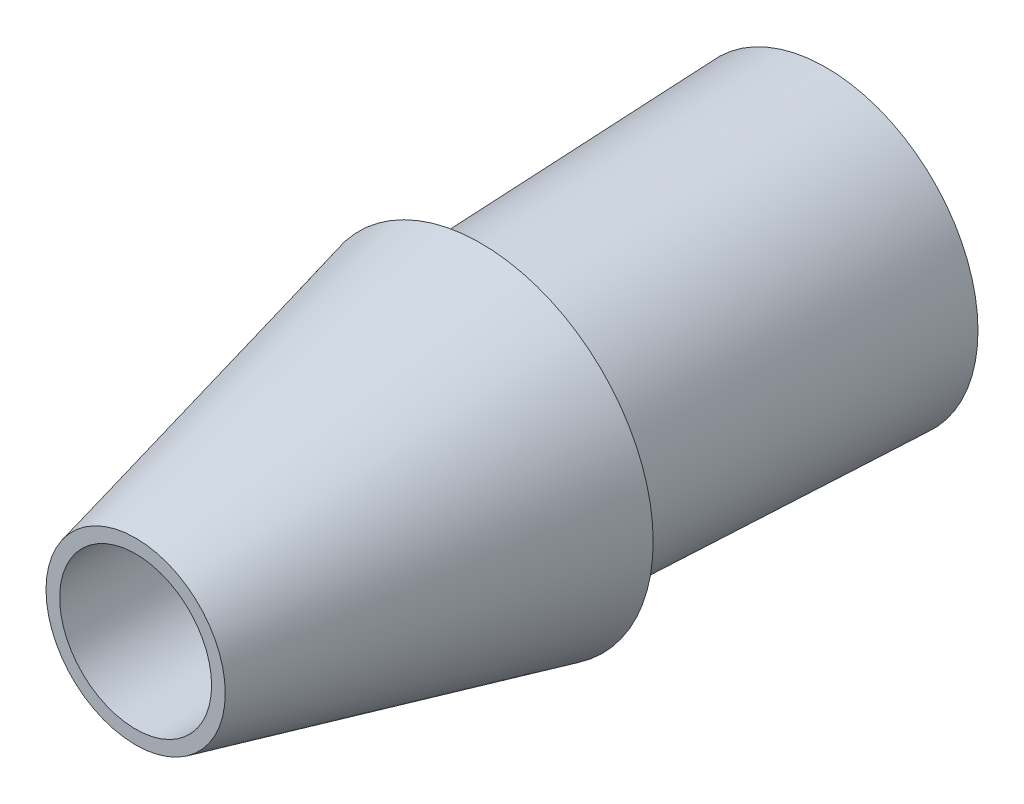
ISO-10303-21;
HEADER;
FILE_DESCRIPTION(('STEP AP214'),'2;1');
FILE_NAME('part.step','',(''),(''),'','','');
FILE_SCHEMA(('AUTOMOTIVE_DESIGN { 1 0 10303 214 1 1 1 1 }'));
ENDSEC;
DATA;
#1=APPLICATION_CONTEXT('core data for automotive mechanical design processes');
#2=APPLICATION_PROTOCOL_DEFINITION('international standard','automotive_design',2000,#1);
#3=PRODUCT_CONTEXT('',#1,'mechanical');
#4=PRODUCT('Part','Part','',(#3));
#5=PRODUCT_RELATED_PRODUCT_CATEGORY('part','',(#4));
#6=PRODUCT_DEFINITION_FORMATION('','',#4);
#7=PRODUCT_DEFINITION_CONTEXT('part definition',#1,'design');
#8=PRODUCT_DEFINITION('design','',#6,#7);
#9=PRODUCT_DEFINITION_SHAPE('','',#8);
#10=(LENGTH_UNIT() NAMED_UNIT(*) SI_UNIT(.MILLI.,.METRE.));
#11=(NAMED_UNIT(*) PLANE_ANGLE_UNIT() SI_UNIT($,.RADIAN.));
#12=(NAMED_UNIT(*) SI_UNIT($,.STERADIAN.) SOLID_ANGLE_UNIT());
#13=UNCERTAINTY_MEASURE_WITH_UNIT(LENGTH_MEASURE(1.E-05),#10,'distance_accuracy_value','');
#14=(GEOMETRIC_REPRESENTATION_CONTEXT(3) GLOBAL_UNCERTAINTY_ASSIGNED_CONTEXT((#13)) GLOBAL_UNIT_ASSIGNED_CONTEXT((#10,
#11,#12)) REPRESENTATION_CONTEXT('',''));
#15=CARTESIAN_POINT('',(0.,0.,0.));
#16=DIRECTION('',(0.,0.,1.));
#17=DIRECTION('',(1.,0.,0.));
#18=AXIS2_PLACEMENT_3D('',#15,#16,#17);
#19=CARTESIAN_POINT('',(0.,0.,0.));
#20=DIRECTION('',(0.,0.,1.));
#21=DIRECTION('',(1.,0.,0.));
#22=AXIS2_PLACEMENT_3D('',#19,#20,#21);
#23=PLANE('',#22);
#24=CARTESIAN_POINT('',(0.,0.,0.));
#25=DIRECTION('',(0.,0.,1.));
#26=DIRECTION('',(1.,0.,0.));
#27=AXIS2_PLACEMENT_3D('',#24,#25,#26);
#28=CIRCLE('',#27,0.903642252561761);
#29=CARTESIAN_POINT('',(0.903642252561761,0.,0.));
#30=VERTEX_POINT('',#29);
#31=EDGE_CURVE('E56',#30,#30,#28,.T.);
#32=ORIENTED_EDGE('',*,*,#31,.T.);
#33=EDGE_LOOP('',(#32));
#34=FACE_BOUND('',#33,.T.);
#35=CARTESIAN_POINT('',(0.,0.,0.));
#36=DIRECTION('',(0.,0.,1.));
#37=DIRECTION('',(1.,0.,0.));
#38=AXIS2_PLACEMENT_3D('',#35,#36,#37);
#39=CIRCLE('',#38,1.1);
#40=CARTESIAN_POINT('',(1.1,0.,0.));
#41=VERTEX_POINT('',#40);
#42=EDGE_CURVE('E50',#41,#41,#39,.T.);
#43=ORIENTED_EDGE('',*,*,#42,.F.);
#44=EDGE_LOOP('',(#43));
#45=FACE_BOUND('',#44,.T.);
#46=ADVANCED_FACE('F41',(#34,#45),#23,.F.);
#47=CARTESIAN_POINT('',(0.,0.,2.5));
#48=DIRECTION('',(0.,0.,-1.));
#49=DIRECTION('',(-1.,0.,0.));
#50=AXIS2_PLACEMENT_3D('',#47,#48,#49);
#51=CONICAL_SURFACE('',#50,1.00380867021687,0.0384575613173809);
#52=ORIENTED_EDGE('',*,*,#42,.T.);
#53=EDGE_LOOP('',(#52));
#54=FACE_BOUND('',#53,.T.);
#55=CARTESIAN_POINT('',(0.,0.,2.5));
#56=DIRECTION('',(0.,0.,1.));
#57=DIRECTION('',(1.,0.,0.));
#58=AXIS2_PLACEMENT_3D('',#55,#56,#57);
#59=CIRCLE('',#58,1.00380867021687);
#60=CARTESIAN_POINT('',(1.00380867021687,0.,2.5));
#61=VERTEX_POINT('',#60);
#62=EDGE_CURVE('E11',#61,#61,#59,.T.);
#63=ORIENTED_EDGE('',*,*,#62,.F.);
#64=EDGE_LOOP('',(#63));
#65=FACE_BOUND('',#64,.T.);
#66=ADVANCED_FACE('F43',(#54,#65),#51,.T.);
#67=CARTESIAN_POINT('',(0.,0.,-7.5));
#68=DIRECTION('',(0.,0.,1.));
#69=DIRECTION('',(1.,0.,0.));
#70=AXIS2_PLACEMENT_3D('',#67,#68,#69);
#71=CYLINDRICAL_SURFACE('',#70,0.903642252561761);
#72=CARTESIAN_POINT('',(0.,0.,2.5));
#73=DIRECTION('',(0.,0.,1.));
#74=DIRECTION('',(1.,0.,0.));
#75=AXIS2_PLACEMENT_3D('',#72,#73,#74);
#76=CIRCLE('',#75,0.903642252561761);
#77=CARTESIAN_POINT('',(0.903642252561761,0.,2.5));
#78=VERTEX_POINT('',#77);
#79=EDGE_CURVE('E63',#78,#78,#76,.T.);
#80=ORIENTED_EDGE('',*,*,#79,.T.);
#81=EDGE_LOOP('',(#80));
#82=FACE_BOUND('',#81,.T.);
#83=ORIENTED_EDGE('',*,*,#31,.F.);
#84=EDGE_LOOP('',(#83));
#85=FACE_BOUND('',#84,.T.);
#86=ADVANCED_FACE('F112',(#82,#85),#71,.F.);
#87=CARTESIAN_POINT('',(0.,0.,5.));
#88=DIRECTION('',(0.,0.,-1.));
#89=DIRECTION('',(-1.,0.,0.));
#90=AXIS2_PLACEMENT_3D('',#87,#88,#89);
#91=CONICAL_SURFACE('',#90,0.649038452892898,0.235118140776221);
#92=CARTESIAN_POINT('',(0.,0.,2.5));
#93=DIRECTION('',(0.,0.,1.));
#94=DIRECTION('',(1.,0.,0.));
#95=AXIS2_PLACEMENT_3D('',#92,#93,#94);
#96=CIRCLE('',#95,1.24791000361087);
#97=CARTESIAN_POINT('',(1.24791000361087,0.,2.5));
#98=VERTEX_POINT('',#97);
#99=EDGE_CURVE('E72',#98,#98,#96,.T.);
#100=ORIENTED_EDGE('',*,*,#99,.T.);
#101=EDGE_LOOP('',(#100));
#102=FACE_BOUND('',#101,.T.);
#103=CARTESIAN_POINT('',(0.,0.,5.));
#104=DIRECTION('',(0.,0.,1.));
#105=DIRECTION('',(1.,0.,0.));
#106=AXIS2_PLACEMENT_3D('',#103,#104,#105);
#107=CIRCLE('',#106,0.649038452892898);
#108=CARTESIAN_POINT('',(0.649038452892898,0.,5.));
#109=VERTEX_POINT('',#108);
#110=EDGE_CURVE('E67',#109,#109,#107,.T.);
#111=ORIENTED_EDGE('',*,*,#110,.F.);
#112=EDGE_LOOP('',(#111));
#113=FACE_BOUND('',#112,.T.);
#114=ADVANCED_FACE('F115',(#102,#113),#91,.T.);
#115=CARTESIAN_POINT('',(0.,0.,5.));
#116=DIRECTION('',(0.,0.,1.));
#117=DIRECTION('',(1.,0.,0.));
#118=AXIS2_PLACEMENT_3D('',#115,#116,#117);
#119=PLANE('',#118);
#120=CARTESIAN_POINT('',(0.,0.,5.));
#121=DIRECTION('',(0.,0.,1.));
#122=DIRECTION('',(1.,0.,0.));
#123=AXIS2_PLACEMENT_3D('',#120,#121,#122);
#124=CIRCLE('',#123,0.55);
#125=CARTESIAN_POINT('',(0.55,0.,5.));
#126=VERTEX_POINT('',#125);
#127=EDGE_CURVE('E149',#126,#126,#124,.T.);
#128=ORIENTED_EDGE('',*,*,#127,.F.);
#129=EDGE_LOOP('',(#128));
#130=FACE_BOUND('',#129,.T.);
#131=ORIENTED_EDGE('',*,*,#110,.T.);
#132=EDGE_LOOP('',(#131));
#133=FACE_BOUND('',#132,.T.);
#134=ADVANCED_FACE('F116',(#130,#133),#119,.T.);
#135=CARTESIAN_POINT('',(0.,0.,2.5));
#136=DIRECTION('',(0.,0.,1.));
#137=DIRECTION('',(1.,0.,0.));
#138=AXIS2_PLACEMENT_3D('',#135,#136,#137);
#139=PLANE('',#138);
#140=ORIENTED_EDGE('',*,*,#99,.F.);
#141=EDGE_LOOP('',(#140));
#142=FACE_BOUND('',#141,.T.);
#143=ORIENTED_EDGE('',*,*,#62,.T.);
#144=EDGE_LOOP('',(#143));
#145=FACE_BOUND('',#144,.T.);
#146=ADVANCED_FACE('F120',(#142,#145),#139,.F.);
#147=CARTESIAN_POINT('',(0.,0.,2.5));
#148=DIRECTION('',(0.,0.,1.));
#149=DIRECTION('',(1.,0.,0.));
#150=AXIS2_PLACEMENT_3D('',#147,#148,#149);
#151=CIRCLE('',#150,0.55);
#152=CARTESIAN_POINT('',(0.55,0.,2.5));
#153=VERTEX_POINT('',#152);
#154=EDGE_CURVE('E46',#153,#153,#151,.T.);
#155=ORIENTED_EDGE('',*,*,#154,.T.);
#156=EDGE_LOOP('',(#155));
#157=FACE_BOUND('',#156,.T.);
#158=ORIENTED_EDGE('',*,*,#79,.F.);
#159=EDGE_LOOP('',(#158));
#160=FACE_BOUND('',#159,.T.);
#161=ADVANCED_FACE('F156',(#157,#160),#139,.F.);
#162=CARTESIAN_POINT('',(0.,0.,-5.));
#163=DIRECTION('',(0.,0.,1.));
#164=DIRECTION('',(1.,0.,0.));
#165=AXIS2_PLACEMENT_3D('',#162,#163,#164);
#166=CYLINDRICAL_SURFACE('',#165,0.55);
#167=ORIENTED_EDGE('',*,*,#127,.T.);
#168=EDGE_LOOP('',(#167));
#169=FACE_BOUND('',#168,.T.);
#170=ORIENTED_EDGE('',*,*,#154,.F.);
#171=EDGE_LOOP('',(#170));
#172=FACE_BOUND('',#171,.T.);
#173=ADVANCED_FACE('F159',(#169,#172),#166,.F.);
#174=CLOSED_SHELL('',(#46,#66,#86,#114,#134,#146,#161,#173));
#175=MANIFOLD_SOLID_BREP('B2',#174);
#176=ADVANCED_BREP_SHAPE_REPRESENTATION('',(#18,#175),#14);
#177=SHAPE_DEFINITION_REPRESENTATION(#9,#176);
ENDSEC;
END-ISO-10303-21;
